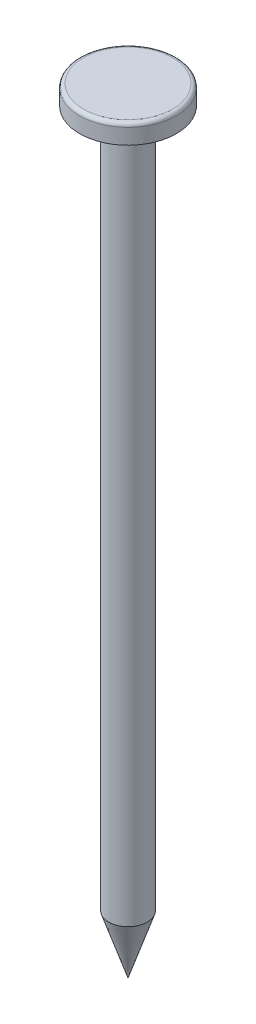
ISO-10303-21;
HEADER;
FILE_DESCRIPTION(('STEP AP214'),'2;1');
FILE_NAME('part.step','',(''),(''),'','','');
FILE_SCHEMA(('AUTOMOTIVE_DESIGN { 1 0 10303 214 1 1 1 1 }'));
ENDSEC;
DATA;
#1=APPLICATION_CONTEXT('core data for automotive mechanical design processes');
#2=APPLICATION_PROTOCOL_DEFINITION('international standard','automotive_design',2000,#1);
#3=PRODUCT_CONTEXT('',#1,'mechanical');
#4=PRODUCT('Part','Part','',(#3));
#5=PRODUCT_RELATED_PRODUCT_CATEGORY('part','',(#4));
#6=PRODUCT_DEFINITION_FORMATION('','',#4);
#7=PRODUCT_DEFINITION_CONTEXT('part definition',#1,'design');
#8=PRODUCT_DEFINITION('design','',#6,#7);
#9=PRODUCT_DEFINITION_SHAPE('','',#8);
#10=(LENGTH_UNIT() NAMED_UNIT(*) SI_UNIT(.MILLI.,.METRE.));
#11=(NAMED_UNIT(*) PLANE_ANGLE_UNIT() SI_UNIT($,.RADIAN.));
#12=(NAMED_UNIT(*) SI_UNIT($,.STERADIAN.) SOLID_ANGLE_UNIT());
#13=UNCERTAINTY_MEASURE_WITH_UNIT(LENGTH_MEASURE(1.E-05),#10,'distance_accuracy_value','');
#14=(GEOMETRIC_REPRESENTATION_CONTEXT(3) GLOBAL_UNCERTAINTY_ASSIGNED_CONTEXT((#13)) GLOBAL_UNIT_ASSIGNED_CONTEXT((#10,
#11,#12)) REPRESENTATION_CONTEXT('',''));
#15=CARTESIAN_POINT('',(0.,0.,0.));
#16=DIRECTION('',(0.,0.,1.));
#17=DIRECTION('',(1.,0.,0.));
#18=AXIS2_PLACEMENT_3D('',#15,#16,#17);
#19=CARTESIAN_POINT('',(0.,0.,0.));
#20=DIRECTION('',(0.,1.,0.));
#21=DIRECTION('',(0.,0.,1.));
#22=AXIS2_PLACEMENT_3D('',#19,#20,#21);
#23=CONICAL_SURFACE('',#22,0.,0.321750554396643);
#24=CARTESIAN_POINT('',(0.,1.5,0.));
#25=DIRECTION('',(0.,-1.,0.));
#26=DIRECTION('',(0.,0.,-1.));
#27=AXIS2_PLACEMENT_3D('',#24,#25,#26);
#28=CIRCLE('',#27,0.500000000000002);
#29=CARTESIAN_POINT('',(0.,1.5,-0.500000000000002));
#30=VERTEX_POINT('',#29);
#31=EDGE_CURVE('E73',#30,#30,#28,.T.);
#32=ORIENTED_EDGE('',*,*,#31,.T.);
#33=EDGE_LOOP('',(#32));
#34=FACE_BOUND('',#33,.T.);
#35=CARTESIAN_POINT('',(0.,0.,0.));
#36=VERTEX_POINT('',#35);
#37=VERTEX_LOOP('',#36);
#38=FACE_BOUND('',#37,.T.);
#39=ADVANCED_FACE('F33',(#34,#38),#23,.T.);
#40=CARTESIAN_POINT('',(0.,-4.46605948899553,0.));
#41=DIRECTION('',(0.,-1.,0.));
#42=DIRECTION('',(0.,0.,-1.));
#43=AXIS2_PLACEMENT_3D('',#40,#41,#42);
#44=CYLINDRICAL_SURFACE('',#43,0.500000000000001);
#45=CARTESIAN_POINT('',(0.,19.5,0.));
#46=DIRECTION('',(0.,-1.,0.));
#47=DIRECTION('',(0.,0.,-1.));
#48=AXIS2_PLACEMENT_3D('',#45,#46,#47);
#49=CIRCLE('',#48,0.500000000000001);
#50=CARTESIAN_POINT('',(0.,19.5,-0.500000000000001));
#51=VERTEX_POINT('',#50);
#52=EDGE_CURVE('E74',#51,#51,#49,.T.);
#53=ORIENTED_EDGE('',*,*,#52,.T.);
#54=EDGE_LOOP('',(#53));
#55=FACE_BOUND('',#54,.T.);
#56=ORIENTED_EDGE('',*,*,#31,.F.);
#57=EDGE_LOOP('',(#56));
#58=FACE_BOUND('',#57,.T.);
#59=ADVANCED_FACE('F44',(#55,#58),#44,.T.);
#60=CARTESIAN_POINT('',(1.25,19.5,0.));
#61=DIRECTION('',(0.,-1.,0.));
#62=DIRECTION('',(0.,0.,-1.));
#63=AXIS2_PLACEMENT_3D('',#60,#61,#62);
#64=PLANE('',#63);
#65=CARTESIAN_POINT('',(0.,19.5,0.));
#66=DIRECTION('',(0.,-1.,0.));
#67=DIRECTION('',(0.,0.,-1.));
#68=AXIS2_PLACEMENT_3D('',#65,#66,#67);
#69=CIRCLE('',#68,1.25);
#70=CARTESIAN_POINT('',(0.,19.5,-1.25));
#71=VERTEX_POINT('',#70);
#72=EDGE_CURVE('E79',#71,#71,#69,.T.);
#73=ORIENTED_EDGE('',*,*,#72,.T.);
#74=EDGE_LOOP('',(#73));
#75=FACE_BOUND('',#74,.T.);
#76=ORIENTED_EDGE('',*,*,#52,.F.);
#77=EDGE_LOOP('',(#76));
#78=FACE_BOUND('',#77,.T.);
#79=ADVANCED_FACE('F49',(#75,#78),#64,.T.);
#80=CARTESIAN_POINT('',(0.,-4.46605948899553,0.));
#81=DIRECTION('',(0.,-1.,0.));
#82=DIRECTION('',(0.,0.,-1.));
#83=AXIS2_PLACEMENT_3D('',#80,#81,#82);
#84=CYLINDRICAL_SURFACE('',#83,1.25);
#85=CARTESIAN_POINT('',(0.,19.9,0.));
#86=DIRECTION('',(0.,1.,0.));
#87=DIRECTION('',(0.,0.,1.));
#88=AXIS2_PLACEMENT_3D('',#85,#86,#87);
#89=CIRCLE('',#88,1.25);
#90=CARTESIAN_POINT('',(0.,19.9,1.25));
#91=VERTEX_POINT('',#90);
#92=EDGE_CURVE('E40',#91,#91,#89,.F.);
#93=ORIENTED_EDGE('',*,*,#92,.T.);
#94=EDGE_LOOP('',(#93));
#95=FACE_BOUND('',#94,.T.);
#96=ORIENTED_EDGE('',*,*,#72,.F.);
#97=EDGE_LOOP('',(#96));
#98=FACE_BOUND('',#97,.T.);
#99=ADVANCED_FACE('F56',(#95,#98),#84,.T.);
#100=CARTESIAN_POINT('',(0.,20.,0.));
#101=DIRECTION('',(0.,1.,0.));
#102=DIRECTION('',(0.,0.,1.));
#103=AXIS2_PLACEMENT_3D('',#100,#101,#102);
#104=PLANE('',#103);
#105=CARTESIAN_POINT('',(0.,20.,0.));
#106=DIRECTION('',(0.,1.,0.));
#107=DIRECTION('',(0.,0.,1.));
#108=AXIS2_PLACEMENT_3D('',#105,#106,#107);
#109=CIRCLE('',#108,1.15);
#110=CARTESIAN_POINT('',(0.,20.,1.15));
#111=VERTEX_POINT('',#110);
#112=EDGE_CURVE('E11',#111,#111,#109,.T.);
#113=ORIENTED_EDGE('',*,*,#112,.T.);
#114=EDGE_LOOP('',(#113));
#115=FACE_BOUND('',#114,.T.);
#116=ADVANCED_FACE('F60',(#115),#104,.T.);
#117=CARTESIAN_POINT('',(0.,19.9,0.));
#118=DIRECTION('',(0.,1.,0.));
#119=DIRECTION('',(0.,0.,1.));
#120=AXIS2_PLACEMENT_3D('',#117,#118,#119);
#121=TOROIDAL_SURFACE('',#120,1.15,0.1);
#122=ORIENTED_EDGE('',*,*,#112,.F.);
#123=EDGE_LOOP('',(#122));
#124=FACE_BOUND('',#123,.T.);
#125=ORIENTED_EDGE('',*,*,#92,.F.);
#126=EDGE_LOOP('',(#125));
#127=FACE_BOUND('',#126,.T.);
#128=ADVANCED_FACE('F35',(#124,#127),#121,.T.);
#129=CLOSED_SHELL('',(#39,#59,#79,#99,#116,#128));
#130=MANIFOLD_SOLID_BREP('B2',#129);
#131=ADVANCED_BREP_SHAPE_REPRESENTATION('',(#18,#130),#14);
#132=SHAPE_DEFINITION_REPRESENTATION(#9,#131);
ENDSEC;
END-ISO-10303-21;
